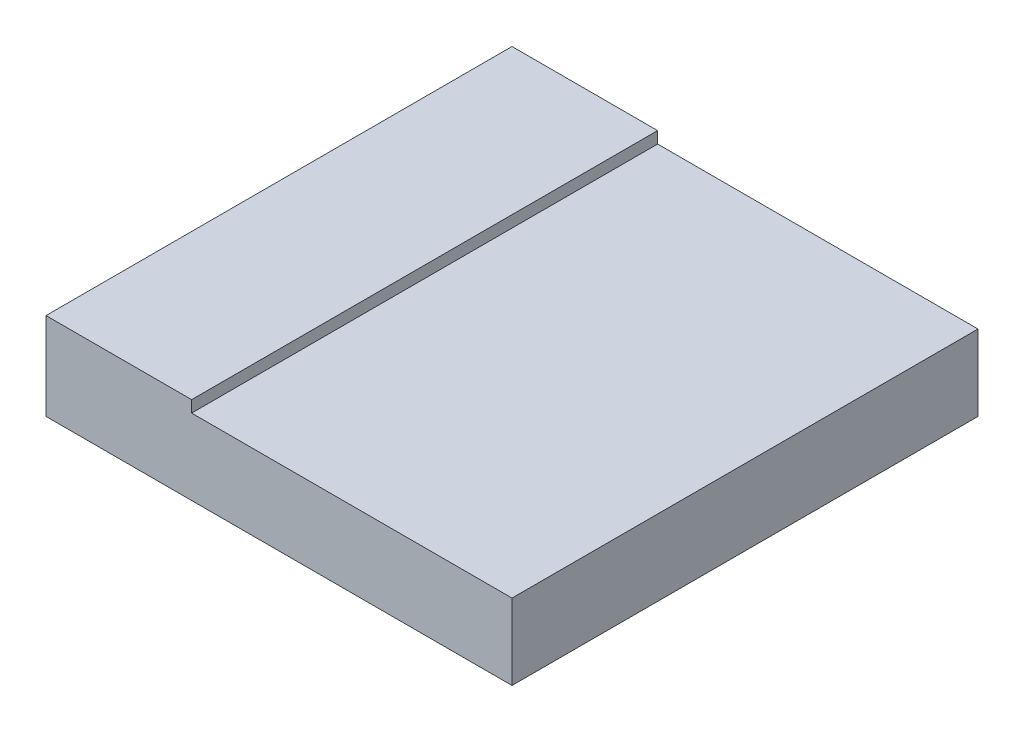
ISO-10303-21;
HEADER;
FILE_DESCRIPTION(('STEP AP214'),'2;1');
FILE_NAME('part.step','',(''),(''),'','','');
FILE_SCHEMA(('AUTOMOTIVE_DESIGN { 1 0 10303 214 1 1 1 1 }'));
ENDSEC;
DATA;
#1=APPLICATION_CONTEXT('core data for automotive mechanical design processes');
#2=APPLICATION_PROTOCOL_DEFINITION('international standard','automotive_design',2000,#1);
#3=PRODUCT_CONTEXT('',#1,'mechanical');
#4=PRODUCT('Part','Part','',(#3));
#5=PRODUCT_RELATED_PRODUCT_CATEGORY('part','',(#4));
#6=PRODUCT_DEFINITION_FORMATION('','',#4);
#7=PRODUCT_DEFINITION_CONTEXT('part definition',#1,'design');
#8=PRODUCT_DEFINITION('design','',#6,#7);
#9=PRODUCT_DEFINITION_SHAPE('','',#8);
#10=(LENGTH_UNIT() NAMED_UNIT(*) SI_UNIT(.MILLI.,.METRE.));
#11=(NAMED_UNIT(*) PLANE_ANGLE_UNIT() SI_UNIT($,.RADIAN.));
#12=(NAMED_UNIT(*) SI_UNIT($,.STERADIAN.) SOLID_ANGLE_UNIT());
#13=UNCERTAINTY_MEASURE_WITH_UNIT(LENGTH_MEASURE(1.E-05),#10,'distance_accuracy_value','');
#14=(GEOMETRIC_REPRESENTATION_CONTEXT(3) GLOBAL_UNCERTAINTY_ASSIGNED_CONTEXT((#13)) GLOBAL_UNIT_ASSIGNED_CONTEXT((#10,
#11,#12)) REPRESENTATION_CONTEXT('',''));
#15=CARTESIAN_POINT('',(0.,0.,0.));
#16=DIRECTION('',(0.,0.,1.));
#17=DIRECTION('',(1.,0.,0.));
#18=AXIS2_PLACEMENT_3D('',#15,#16,#17);
#19=CARTESIAN_POINT('',(101.6,19.05,0.));
#20=DIRECTION('',(-1.,0.,0.));
#21=DIRECTION('',(0.,0.,1.));
#22=AXIS2_PLACEMENT_3D('',#19,#20,#21);
#23=PLANE('',#22);
#24=DIRECTION('',(0.,0.,-1.));
#25=VECTOR('',#24,1.);
#26=CARTESIAN_POINT('',(101.6,16.51,0.));
#27=LINE('',#26,#25);
#28=CARTESIAN_POINT('',(101.6,16.51,0.));
#29=VERTEX_POINT('',#28);
#30=CARTESIAN_POINT('',(101.6,16.51,-101.6));
#31=VERTEX_POINT('',#30);
#32=EDGE_CURVE('E111',#29,#31,#27,.T.);
#33=ORIENTED_EDGE('',*,*,#32,.F.);
#34=DIRECTION('',(0.,-1.,0.));
#35=VECTOR('',#34,1.);
#36=CARTESIAN_POINT('',(101.6,19.05,0.));
#37=LINE('',#36,#35);
#38=CARTESIAN_POINT('',(101.6,0.,0.));
#39=VERTEX_POINT('',#38);
#40=EDGE_CURVE('E41',#29,#39,#37,.T.);
#41=ORIENTED_EDGE('',*,*,#40,.T.);
#42=DIRECTION('',(0.,0.,-1.));
#43=VECTOR('',#42,1.);
#44=CARTESIAN_POINT('',(101.6,0.,0.));
#45=LINE('',#44,#43);
#46=CARTESIAN_POINT('',(101.6,0.,-101.6));
#47=VERTEX_POINT('',#46);
#48=EDGE_CURVE('E88',#39,#47,#45,.T.);
#49=ORIENTED_EDGE('',*,*,#48,.T.);
#50=DIRECTION('',(0.,-1.,0.));
#51=VECTOR('',#50,1.);
#52=CARTESIAN_POINT('',(101.6,19.05,-101.6));
#53=LINE('',#52,#51);
#54=EDGE_CURVE('E82',#31,#47,#53,.T.);
#55=ORIENTED_EDGE('',*,*,#54,.F.);
#56=EDGE_LOOP('',(#33,#41,#49,#55));
#57=FACE_BOUND('',#56,.T.);
#58=ADVANCED_FACE('F33',(#57),#23,.F.);
#59=CARTESIAN_POINT('',(0.,19.05,0.));
#60=DIRECTION('',(1.,0.,0.));
#61=DIRECTION('',(0.,0.,-1.));
#62=AXIS2_PLACEMENT_3D('',#59,#60,#61);
#63=PLANE('',#62);
#64=DIRECTION('',(0.,0.,1.));
#65=VECTOR('',#64,1.);
#66=CARTESIAN_POINT('',(0.,0.,0.));
#67=LINE('',#66,#65);
#68=CARTESIAN_POINT('',(0.,0.,-101.6));
#69=VERTEX_POINT('',#68);
#70=CARTESIAN_POINT('',(0.,0.,0.));
#71=VERTEX_POINT('',#70);
#72=EDGE_CURVE('E93',#69,#71,#67,.T.);
#73=ORIENTED_EDGE('',*,*,#72,.T.);
#74=DIRECTION('',(0.,-1.,0.));
#75=VECTOR('',#74,1.);
#76=CARTESIAN_POINT('',(0.,19.05,0.));
#77=LINE('',#76,#75);
#78=CARTESIAN_POINT('',(0.,19.05,0.));
#79=VERTEX_POINT('',#78);
#80=EDGE_CURVE('E11',#79,#71,#77,.T.);
#81=ORIENTED_EDGE('',*,*,#80,.F.);
#82=DIRECTION('',(0.,0.,1.));
#83=VECTOR('',#82,1.);
#84=CARTESIAN_POINT('',(0.,19.05,0.));
#85=LINE('',#84,#83);
#86=CARTESIAN_POINT('',(0.,19.05,-101.6));
#87=VERTEX_POINT('',#86);
#88=EDGE_CURVE('E87',#87,#79,#85,.T.);
#89=ORIENTED_EDGE('',*,*,#88,.F.);
#90=DIRECTION('',(0.,-1.,0.));
#91=VECTOR('',#90,1.);
#92=CARTESIAN_POINT('',(0.,19.05,-101.6));
#93=LINE('',#92,#91);
#94=EDGE_CURVE('E78',#87,#69,#93,.T.);
#95=ORIENTED_EDGE('',*,*,#94,.T.);
#96=EDGE_LOOP('',(#73,#81,#89,#95));
#97=FACE_BOUND('',#96,.T.);
#98=ADVANCED_FACE('F35',(#97),#63,.F.);
#99=CARTESIAN_POINT('',(0.,19.05,0.));
#100=DIRECTION('',(0.,0.,-1.));
#101=DIRECTION('',(-1.,0.,0.));
#102=AXIS2_PLACEMENT_3D('',#99,#100,#101);
#103=PLANE('',#102);
#104=DIRECTION('',(1.,0.,0.));
#105=VECTOR('',#104,1.);
#106=CARTESIAN_POINT('',(101.6,16.51,0.));
#107=LINE('',#106,#105);
#108=CARTESIAN_POINT('',(31.75,16.51,0.));
#109=VERTEX_POINT('',#108);
#110=EDGE_CURVE('E122',#109,#29,#107,.T.);
#111=ORIENTED_EDGE('',*,*,#110,.F.);
#112=DIRECTION('',(0.,1.,0.));
#113=VECTOR('',#112,1.);
#114=CARTESIAN_POINT('',(31.75,16.51,0.));
#115=LINE('',#114,#113);
#116=CARTESIAN_POINT('',(31.75,19.05,0.));
#117=VERTEX_POINT('',#116);
#118=EDGE_CURVE('E98',#109,#117,#115,.T.);
#119=ORIENTED_EDGE('',*,*,#118,.T.);
#120=DIRECTION('',(1.,0.,0.));
#121=VECTOR('',#120,1.);
#122=CARTESIAN_POINT('',(0.,19.05,0.));
#123=LINE('',#122,#121);
#124=EDGE_CURVE('E116',#79,#117,#123,.T.);
#125=ORIENTED_EDGE('',*,*,#124,.F.);
#126=ORIENTED_EDGE('',*,*,#80,.T.);
#127=DIRECTION('',(1.,0.,0.));
#128=VECTOR('',#127,1.);
#129=CARTESIAN_POINT('',(0.,0.,0.));
#130=LINE('',#129,#128);
#131=EDGE_CURVE('E97',#71,#39,#130,.T.);
#132=ORIENTED_EDGE('',*,*,#131,.T.);
#133=ORIENTED_EDGE('',*,*,#40,.F.);
#134=EDGE_LOOP('',(#111,#119,#125,#126,#132,#133));
#135=FACE_BOUND('',#134,.T.);
#136=ADVANCED_FACE('F114',(#135),#103,.F.);
#137=CARTESIAN_POINT('',(0.,19.05,-101.6));
#138=DIRECTION('',(0.,0.,1.));
#139=DIRECTION('',(1.,0.,0.));
#140=AXIS2_PLACEMENT_3D('',#137,#138,#139);
#141=PLANE('',#140);
#142=DIRECTION('',(-1.,0.,0.));
#143=VECTOR('',#142,1.);
#144=CARTESIAN_POINT('',(0.,19.05,-101.6));
#145=LINE('',#144,#143);
#146=CARTESIAN_POINT('',(31.75,19.05,-101.6));
#147=VERTEX_POINT('',#146);
#148=EDGE_CURVE('E56',#147,#87,#145,.T.);
#149=ORIENTED_EDGE('',*,*,#148,.F.);
#150=DIRECTION('',(0.,1.,0.));
#151=VECTOR('',#150,1.);
#152=CARTESIAN_POINT('',(31.75,16.51,-101.6));
#153=LINE('',#152,#151);
#154=CARTESIAN_POINT('',(31.75,16.51,-101.6));
#155=VERTEX_POINT('',#154);
#156=EDGE_CURVE('E48',#155,#147,#153,.T.);
#157=ORIENTED_EDGE('',*,*,#156,.F.);
#158=DIRECTION('',(-1.,0.,0.));
#159=VECTOR('',#158,1.);
#160=CARTESIAN_POINT('',(101.6,16.51,-101.6));
#161=LINE('',#160,#159);
#162=EDGE_CURVE('E131',#31,#155,#161,.T.);
#163=ORIENTED_EDGE('',*,*,#162,.F.);
#164=ORIENTED_EDGE('',*,*,#54,.T.);
#165=DIRECTION('',(-1.,0.,0.));
#166=VECTOR('',#165,1.);
#167=CARTESIAN_POINT('',(0.,0.,-101.6));
#168=LINE('',#167,#166);
#169=EDGE_CURVE('E75',#47,#69,#168,.T.);
#170=ORIENTED_EDGE('',*,*,#169,.T.);
#171=ORIENTED_EDGE('',*,*,#94,.F.);
#172=EDGE_LOOP('',(#149,#157,#163,#164,#170,#171));
#173=FACE_BOUND('',#172,.T.);
#174=ADVANCED_FACE('F77',(#173),#141,.F.);
#175=CARTESIAN_POINT('',(0.,19.05,0.));
#176=DIRECTION('',(0.,-1.,0.));
#177=DIRECTION('',(0.,0.,-1.));
#178=AXIS2_PLACEMENT_3D('',#175,#176,#177);
#179=PLANE('',#178);
#180=ORIENTED_EDGE('',*,*,#124,.T.);
#181=DIRECTION('',(0.,0.,1.));
#182=VECTOR('',#181,1.);
#183=CARTESIAN_POINT('',(31.75,19.05,0.));
#184=LINE('',#183,#182);
#185=EDGE_CURVE('E124',#147,#117,#184,.T.);
#186=ORIENTED_EDGE('',*,*,#185,.F.);
#187=ORIENTED_EDGE('',*,*,#148,.T.);
#188=ORIENTED_EDGE('',*,*,#88,.T.);
#189=EDGE_LOOP('',(#180,#186,#187,#188));
#190=FACE_BOUND('',#189,.T.);
#191=ADVANCED_FACE('F119',(#190),#179,.F.);
#192=CARTESIAN_POINT('',(0.,0.,0.));
#193=DIRECTION('',(0.,-1.,0.));
#194=DIRECTION('',(0.,0.,-1.));
#195=AXIS2_PLACEMENT_3D('',#192,#193,#194);
#196=PLANE('',#195);
#197=ORIENTED_EDGE('',*,*,#72,.F.);
#198=ORIENTED_EDGE('',*,*,#169,.F.);
#199=ORIENTED_EDGE('',*,*,#48,.F.);
#200=ORIENTED_EDGE('',*,*,#131,.F.);
#201=EDGE_LOOP('',(#197,#198,#199,#200));
#202=FACE_BOUND('',#201,.T.);
#203=ADVANCED_FACE('F95',(#202),#196,.T.);
#204=CARTESIAN_POINT('',(31.75,16.51,0.));
#205=DIRECTION('',(-1.,0.,0.));
#206=DIRECTION('',(0.,0.,1.));
#207=AXIS2_PLACEMENT_3D('',#204,#205,#206);
#208=PLANE('',#207);
#209=ORIENTED_EDGE('',*,*,#185,.T.);
#210=ORIENTED_EDGE('',*,*,#118,.F.);
#211=DIRECTION('',(0.,0.,1.));
#212=VECTOR('',#211,1.);
#213=CARTESIAN_POINT('',(31.75,16.51,0.));
#214=LINE('',#213,#212);
#215=EDGE_CURVE('E128',#155,#109,#214,.T.);
#216=ORIENTED_EDGE('',*,*,#215,.F.);
#217=ORIENTED_EDGE('',*,*,#156,.T.);
#218=EDGE_LOOP('',(#209,#210,#216,#217));
#219=FACE_BOUND('',#218,.T.);
#220=ADVANCED_FACE('F143',(#219),#208,.F.);
#221=CARTESIAN_POINT('',(0.,16.51,0.));
#222=DIRECTION('',(0.,1.,0.));
#223=DIRECTION('',(0.,0.,1.));
#224=AXIS2_PLACEMENT_3D('',#221,#222,#223);
#225=PLANE('',#224);
#226=ORIENTED_EDGE('',*,*,#32,.T.);
#227=ORIENTED_EDGE('',*,*,#162,.T.);
#228=ORIENTED_EDGE('',*,*,#215,.T.);
#229=ORIENTED_EDGE('',*,*,#110,.T.);
#230=EDGE_LOOP('',(#226,#227,#228,#229));
#231=FACE_BOUND('',#230,.T.);
#232=ADVANCED_FACE('F136',(#231),#225,.T.);
#233=CLOSED_SHELL('',(#58,#98,#136,#174,#191,#203,#220,#232));
#234=MANIFOLD_SOLID_BREP('B2',#233);
#235=ADVANCED_BREP_SHAPE_REPRESENTATION('',(#18,#234),#14);
#236=SHAPE_DEFINITION_REPRESENTATION(#9,#235);
ENDSEC;
END-ISO-10303-21;
